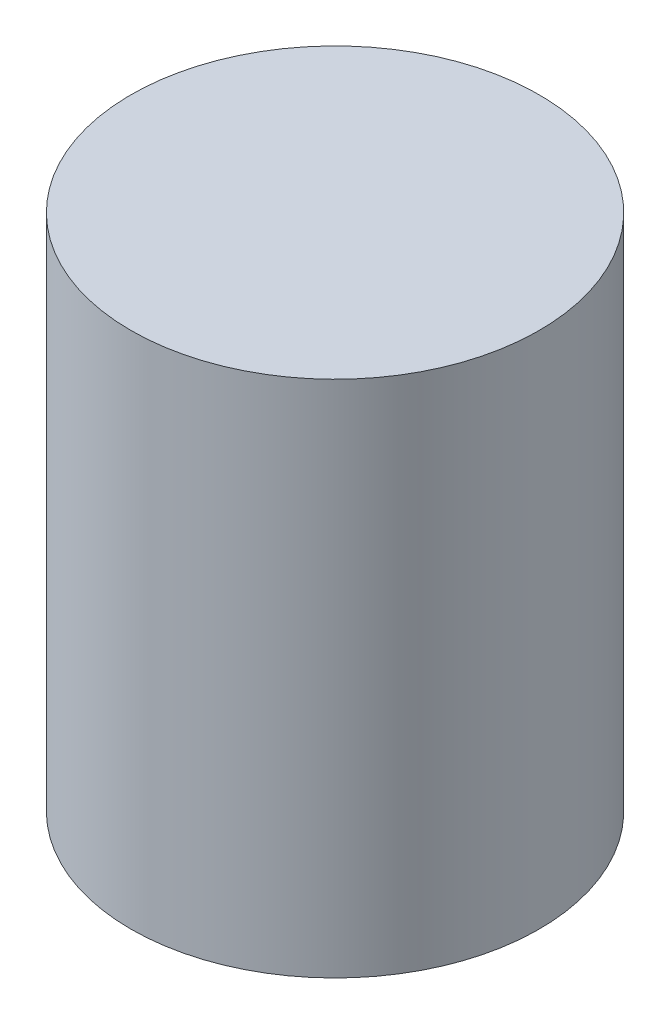
ISO-10303-21;
HEADER;
FILE_DESCRIPTION(('STEP AP214'),'2;1');
FILE_NAME('part.step','',(''),(''),'','','');
FILE_SCHEMA(('AUTOMOTIVE_DESIGN { 1 0 10303 214 1 1 1 1 }'));
ENDSEC;
DATA;
#1=APPLICATION_CONTEXT('core data for automotive mechanical design processes');
#2=APPLICATION_PROTOCOL_DEFINITION('international standard','automotive_design',2000,#1);
#3=PRODUCT_CONTEXT('',#1,'mechanical');
#4=PRODUCT('Part','Part','',(#3));
#5=PRODUCT_RELATED_PRODUCT_CATEGORY('part','',(#4));
#6=PRODUCT_DEFINITION_FORMATION('','',#4);
#7=PRODUCT_DEFINITION_CONTEXT('part definition',#1,'design');
#8=PRODUCT_DEFINITION('design','',#6,#7);
#9=PRODUCT_DEFINITION_SHAPE('','',#8);
#10=(LENGTH_UNIT() NAMED_UNIT(*) SI_UNIT(.MILLI.,.METRE.));
#11=(NAMED_UNIT(*) PLANE_ANGLE_UNIT() SI_UNIT($,.RADIAN.));
#12=(NAMED_UNIT(*) SI_UNIT($,.STERADIAN.) SOLID_ANGLE_UNIT());
#13=UNCERTAINTY_MEASURE_WITH_UNIT(LENGTH_MEASURE(1.E-05),#10,'distance_accuracy_value','');
#14=(GEOMETRIC_REPRESENTATION_CONTEXT(3) GLOBAL_UNCERTAINTY_ASSIGNED_CONTEXT((#13)) GLOBAL_UNIT_ASSIGNED_CONTEXT((#10,
#11,#12)) REPRESENTATION_CONTEXT('',''));
#15=CARTESIAN_POINT('',(0.,0.,0.));
#16=DIRECTION('',(0.,0.,1.));
#17=DIRECTION('',(1.,0.,0.));
#18=AXIS2_PLACEMENT_3D('',#15,#16,#17);
#19=CARTESIAN_POINT('',(0.,63.5,0.));
#20=DIRECTION('',(0.,-1.,0.));
#21=DIRECTION('',(0.,0.,-1.));
#22=AXIS2_PLACEMENT_3D('',#19,#20,#21);
#23=CYLINDRICAL_SURFACE('',#22,25.);
#24=CARTESIAN_POINT('',(0.,63.5,0.));
#25=DIRECTION('',(0.,1.,0.));
#26=DIRECTION('',(0.,0.,1.));
#27=AXIS2_PLACEMENT_3D('',#24,#25,#26);
#28=CIRCLE('',#27,25.);
#29=CARTESIAN_POINT('',(0.,63.5,25.));
#30=VERTEX_POINT('',#29);
#31=EDGE_CURVE('E10',#30,#30,#28,.T.);
#32=ORIENTED_EDGE('',*,*,#31,.F.);
#33=EDGE_LOOP('',(#32));
#34=FACE_BOUND('',#33,.T.);
#35=CARTESIAN_POINT('',(0.,0.,0.));
#36=DIRECTION('',(0.,1.,0.));
#37=DIRECTION('',(0.,0.,1.));
#38=AXIS2_PLACEMENT_3D('',#35,#36,#37);
#39=CIRCLE('',#38,25.);
#40=CARTESIAN_POINT('',(0.,0.,25.));
#41=VERTEX_POINT('',#40);
#42=EDGE_CURVE('E34',#41,#41,#39,.T.);
#43=ORIENTED_EDGE('',*,*,#42,.T.);
#44=EDGE_LOOP('',(#43));
#45=FACE_BOUND('',#44,.T.);
#46=ADVANCED_FACE('F31',(#34,#45),#23,.T.);
#47=CARTESIAN_POINT('',(0.,63.5,0.));
#48=DIRECTION('',(0.,1.,0.));
#49=DIRECTION('',(0.,0.,1.));
#50=AXIS2_PLACEMENT_3D('',#47,#48,#49);
#51=PLANE('',#50);
#52=ORIENTED_EDGE('',*,*,#31,.T.);
#53=EDGE_LOOP('',(#52));
#54=FACE_BOUND('',#53,.T.);
#55=ADVANCED_FACE('F46',(#54),#51,.T.);
#56=CARTESIAN_POINT('',(0.,0.,0.));
#57=DIRECTION('',(0.,1.,0.));
#58=DIRECTION('',(0.,0.,1.));
#59=AXIS2_PLACEMENT_3D('',#56,#57,#58);
#60=PLANE('',#59);
#61=ORIENTED_EDGE('',*,*,#42,.F.);
#62=EDGE_LOOP('',(#61));
#63=FACE_BOUND('',#62,.T.);
#64=ADVANCED_FACE('F44',(#63),#60,.F.);
#65=CLOSED_SHELL('',(#46,#55,#64));
#66=MANIFOLD_SOLID_BREP('B2',#65);
#67=ADVANCED_BREP_SHAPE_REPRESENTATION('',(#18,#66),#14);
#68=SHAPE_DEFINITION_REPRESENTATION(#9,#67);
ENDSEC;
END-ISO-10303-21;
